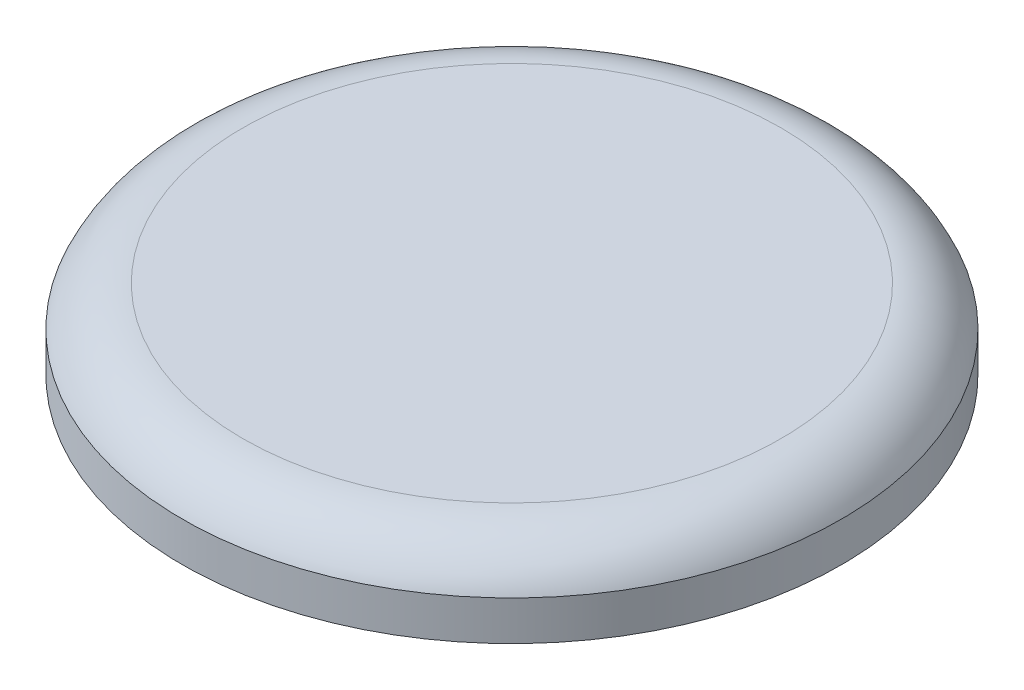
ISO-10303-21;
HEADER;
FILE_DESCRIPTION(('STEP AP214'),'2;1');
FILE_NAME('part.step','',(''),(''),'','','');
FILE_SCHEMA(('AUTOMOTIVE_DESIGN { 1 0 10303 214 1 1 1 1 }'));
ENDSEC;
DATA;
#1=APPLICATION_CONTEXT('core data for automotive mechanical design processes');
#2=APPLICATION_PROTOCOL_DEFINITION('international standard','automotive_design',2000,#1);
#3=PRODUCT_CONTEXT('',#1,'mechanical');
#4=PRODUCT('Part','Part','',(#3));
#5=PRODUCT_RELATED_PRODUCT_CATEGORY('part','',(#4));
#6=PRODUCT_DEFINITION_FORMATION('','',#4);
#7=PRODUCT_DEFINITION_CONTEXT('part definition',#1,'design');
#8=PRODUCT_DEFINITION('design','',#6,#7);
#9=PRODUCT_DEFINITION_SHAPE('','',#8);
#10=(LENGTH_UNIT() NAMED_UNIT(*) SI_UNIT(.MILLI.,.METRE.));
#11=(NAMED_UNIT(*) PLANE_ANGLE_UNIT() SI_UNIT($,.RADIAN.));
#12=(NAMED_UNIT(*) SI_UNIT($,.STERADIAN.) SOLID_ANGLE_UNIT());
#13=UNCERTAINTY_MEASURE_WITH_UNIT(LENGTH_MEASURE(1.E-05),#10,'distance_accuracy_value','');
#14=(GEOMETRIC_REPRESENTATION_CONTEXT(3) GLOBAL_UNCERTAINTY_ASSIGNED_CONTEXT((#13)) GLOBAL_UNIT_ASSIGNED_CONTEXT((#10,
#11,#12)) REPRESENTATION_CONTEXT('',''));
#15=CARTESIAN_POINT('',(0.,0.,0.));
#16=DIRECTION('',(0.,0.,1.));
#17=DIRECTION('',(1.,0.,0.));
#18=AXIS2_PLACEMENT_3D('',#15,#16,#17);
#19=CARTESIAN_POINT('',(0.,3.,0.));
#20=DIRECTION('',(0.,1.,0.));
#21=DIRECTION('',(0.,0.,1.));
#22=AXIS2_PLACEMENT_3D('',#19,#20,#21);
#23=PLANE('',#22);
#24=CARTESIAN_POINT('',(0.,3.,0.));
#25=DIRECTION('',(0.,1.,0.));
#26=DIRECTION('',(0.,0.,1.));
#27=AXIS2_PLACEMENT_3D('',#24,#25,#26);
#28=CIRCLE('',#27,20.4174243050442);
#29=CARTESIAN_POINT('',(0.,3.,20.4174243050442));
#30=VERTEX_POINT('',#29);
#31=EDGE_CURVE('E10',#30,#30,#28,.T.);
#32=ORIENTED_EDGE('',*,*,#31,.T.);
#33=EDGE_LOOP('',(#32));
#34=FACE_BOUND('',#33,.T.);
#35=ADVANCED_FACE('F37',(#34),#23,.T.);
#36=CARTESIAN_POINT('',(0.,-2.,0.));
#37=DIRECTION('',(0.,-1.,0.));
#38=DIRECTION('',(0.,0.,-1.));
#39=AXIS2_PLACEMENT_3D('',#36,#37,#38);
#40=TOROIDAL_SURFACE('',#39,20.4174243050442,5.);
#41=CARTESIAN_POINT('',(0.,0.,0.));
#42=DIRECTION('',(0.,-1.,0.));
#43=DIRECTION('',(0.,0.,-1.));
#44=AXIS2_PLACEMENT_3D('',#41,#42,#43);
#45=CIRCLE('',#44,25.);
#46=CARTESIAN_POINT('',(0.,0.,-25.));
#47=VERTEX_POINT('',#46);
#48=EDGE_CURVE('E50',#47,#47,#45,.T.);
#49=ORIENTED_EDGE('',*,*,#48,.F.);
#50=EDGE_LOOP('',(#49));
#51=FACE_BOUND('',#50,.T.);
#52=ORIENTED_EDGE('',*,*,#31,.F.);
#53=EDGE_LOOP('',(#52));
#54=FACE_BOUND('',#53,.T.);
#55=ADVANCED_FACE('F39',(#51,#54),#40,.T.);
#56=CARTESIAN_POINT('',(0.,-3.,0.));
#57=DIRECTION('',(0.,1.,0.));
#58=DIRECTION('',(0.,0.,1.));
#59=AXIS2_PLACEMENT_3D('',#56,#57,#58);
#60=CYLINDRICAL_SURFACE('',#59,25.);
#61=CARTESIAN_POINT('',(0.,-3.,0.));
#62=DIRECTION('',(0.,-1.,0.));
#63=DIRECTION('',(0.,0.,-1.));
#64=AXIS2_PLACEMENT_3D('',#61,#62,#63);
#65=CIRCLE('',#64,25.);
#66=CARTESIAN_POINT('',(0.,-3.,-25.));
#67=VERTEX_POINT('',#66);
#68=EDGE_CURVE('E45',#67,#67,#65,.T.);
#69=ORIENTED_EDGE('',*,*,#68,.F.);
#70=EDGE_LOOP('',(#69));
#71=FACE_BOUND('',#70,.T.);
#72=ORIENTED_EDGE('',*,*,#48,.T.);
#73=EDGE_LOOP('',(#72));
#74=FACE_BOUND('',#73,.T.);
#75=ADVANCED_FACE('F58',(#71,#74),#60,.T.);
#76=CARTESIAN_POINT('',(0.,-3.,0.));
#77=DIRECTION('',(0.,-1.,0.));
#78=DIRECTION('',(0.,0.,-1.));
#79=AXIS2_PLACEMENT_3D('',#76,#77,#78);
#80=PLANE('',#79);
#81=ORIENTED_EDGE('',*,*,#68,.T.);
#82=EDGE_LOOP('',(#81));
#83=FACE_BOUND('',#82,.T.);
#84=ADVANCED_FACE('F66',(#83),#80,.T.);
#85=CLOSED_SHELL('',(#35,#55,#75,#84));
#86=MANIFOLD_SOLID_BREP('B2',#85);
#87=ADVANCED_BREP_SHAPE_REPRESENTATION('',(#18,#86),#14);
#88=SHAPE_DEFINITION_REPRESENTATION(#9,#87);
ENDSEC;
END-ISO-10303-21;
